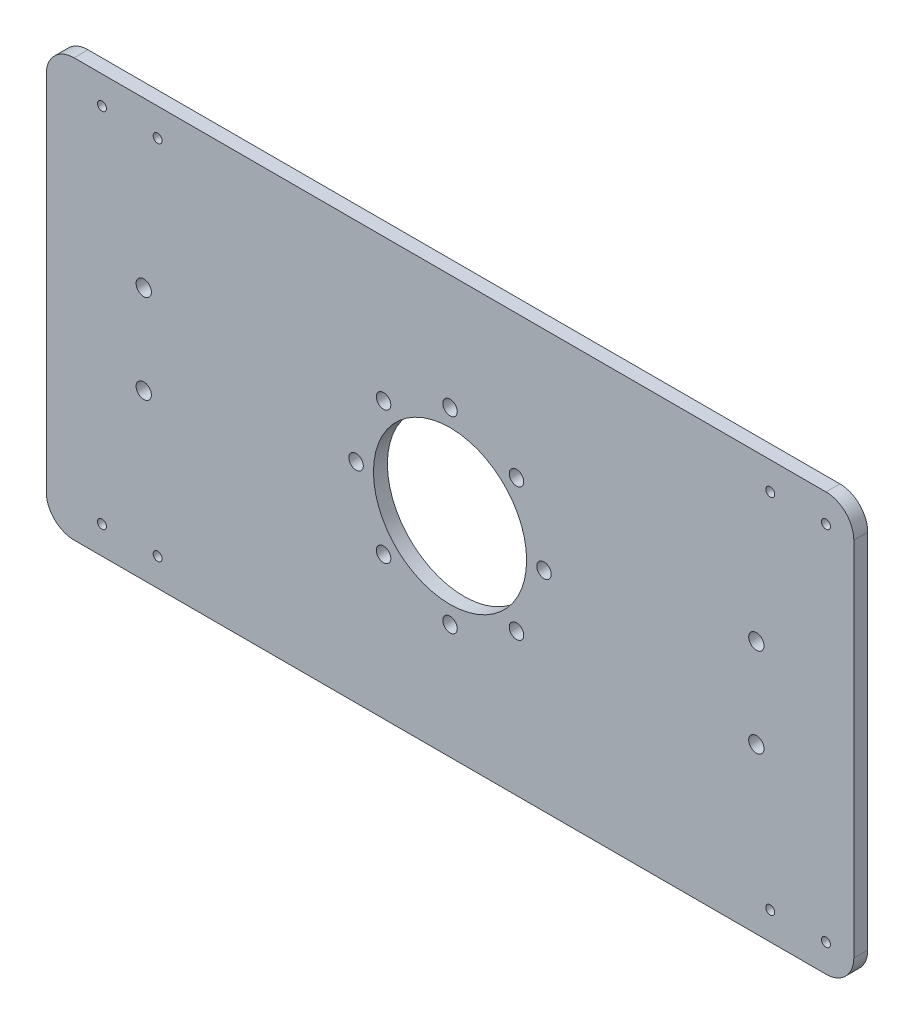
ISO-10303-21;
HEADER;
FILE_DESCRIPTION(('STEP AP214'),'2;1');
FILE_NAME('part.step','',(''),(''),'','','');
FILE_SCHEMA(('AUTOMOTIVE_DESIGN { 1 0 10303 214 1 1 1 1 }'));
ENDSEC;
DATA;
#1=APPLICATION_CONTEXT('core data for automotive mechanical design processes');
#2=APPLICATION_PROTOCOL_DEFINITION('international standard','automotive_design',2000,#1);
#3=PRODUCT_CONTEXT('',#1,'mechanical');
#4=PRODUCT('Part','Part','',(#3));
#5=PRODUCT_RELATED_PRODUCT_CATEGORY('part','',(#4));
#6=PRODUCT_DEFINITION_FORMATION('','',#4);
#7=PRODUCT_DEFINITION_CONTEXT('part definition',#1,'design');
#8=PRODUCT_DEFINITION('design','',#6,#7);
#9=PRODUCT_DEFINITION_SHAPE('','',#8);
#10=(LENGTH_UNIT() NAMED_UNIT(*) SI_UNIT(.MILLI.,.METRE.));
#11=(NAMED_UNIT(*) PLANE_ANGLE_UNIT() SI_UNIT($,.RADIAN.));
#12=(NAMED_UNIT(*) SI_UNIT($,.STERADIAN.) SOLID_ANGLE_UNIT());
#13=UNCERTAINTY_MEASURE_WITH_UNIT(LENGTH_MEASURE(1.E-05),#10,'distance_accuracy_value','');
#14=(GEOMETRIC_REPRESENTATION_CONTEXT(3) GLOBAL_UNCERTAINTY_ASSIGNED_CONTEXT((#13)) GLOBAL_UNIT_ASSIGNED_CONTEXT((#10,
#11,#12)) REPRESENTATION_CONTEXT('',''));
#15=CARTESIAN_POINT('',(0.,0.,0.));
#16=DIRECTION('',(0.,0.,1.));
#17=DIRECTION('',(1.,0.,0.));
#18=AXIS2_PLACEMENT_3D('',#15,#16,#17);
#19=CARTESIAN_POINT('',(145.,75.,5.));
#20=DIRECTION('',(-1.,0.,0.));
#21=DIRECTION('',(0.,0.,1.));
#22=AXIS2_PLACEMENT_3D('',#19,#20,#21);
#23=PLANE('',#22);
#24=DIRECTION('',(0.,1.,0.));
#25=VECTOR('',#24,1.);
#26=CARTESIAN_POINT('',(145.,75.,0.));
#27=LINE('',#26,#25);
#28=CARTESIAN_POINT('',(145.,-65.,0.));
#29=VERTEX_POINT('',#28);
#30=CARTESIAN_POINT('',(145.,65.,0.));
#31=VERTEX_POINT('',#30);
#32=EDGE_CURVE('E138',#29,#31,#27,.T.);
#33=ORIENTED_EDGE('',*,*,#32,.T.);
#34=DIRECTION('',(0.,0.,-1.));
#35=VECTOR('',#34,1.);
#36=CARTESIAN_POINT('',(145.,65.,5.));
#37=LINE('',#36,#35);
#38=CARTESIAN_POINT('',(145.,65.,5.));
#39=VERTEX_POINT('',#38);
#40=EDGE_CURVE('E116',#31,#39,#37,.F.);
#41=ORIENTED_EDGE('',*,*,#40,.T.);
#42=DIRECTION('',(0.,1.,0.));
#43=VECTOR('',#42,1.);
#44=CARTESIAN_POINT('',(145.,75.,5.));
#45=LINE('',#44,#43);
#46=CARTESIAN_POINT('',(145.,-65.,5.));
#47=VERTEX_POINT('',#46);
#48=EDGE_CURVE('E148',#47,#39,#45,.T.);
#49=ORIENTED_EDGE('',*,*,#48,.F.);
#50=DIRECTION('',(0.,0.,-1.));
#51=VECTOR('',#50,1.);
#52=CARTESIAN_POINT('',(145.,-65.,5.));
#53=LINE('',#52,#51);
#54=EDGE_CURVE('E121',#47,#29,#53,.T.);
#55=ORIENTED_EDGE('',*,*,#54,.T.);
#56=EDGE_LOOP('',(#33,#41,#49,#55));
#57=FACE_BOUND('',#56,.T.);
#58=ADVANCED_FACE('F45',(#57),#23,.F.);
#59=CARTESIAN_POINT('',(-145.,75.,5.));
#60=DIRECTION('',(0.,-1.,0.));
#61=DIRECTION('',(0.,0.,-1.));
#62=AXIS2_PLACEMENT_3D('',#59,#60,#61);
#63=PLANE('',#62);
#64=DIRECTION('',(-1.,0.,0.));
#65=VECTOR('',#64,1.);
#66=CARTESIAN_POINT('',(-145.,75.,5.));
#67=LINE('',#66,#65);
#68=CARTESIAN_POINT('',(135.,75.,5.));
#69=VERTEX_POINT('',#68);
#70=CARTESIAN_POINT('',(-135.,75.,5.));
#71=VERTEX_POINT('',#70);
#72=EDGE_CURVE('E131',#69,#71,#67,.T.);
#73=ORIENTED_EDGE('',*,*,#72,.F.);
#74=DIRECTION('',(0.,0.,-1.));
#75=VECTOR('',#74,1.);
#76=CARTESIAN_POINT('',(135.,75.,5.));
#77=LINE('',#76,#75);
#78=CARTESIAN_POINT('',(135.,75.,0.));
#79=VERTEX_POINT('',#78);
#80=EDGE_CURVE('E115',#69,#79,#77,.T.);
#81=ORIENTED_EDGE('',*,*,#80,.T.);
#82=DIRECTION('',(-1.,0.,0.));
#83=VECTOR('',#82,1.);
#84=CARTESIAN_POINT('',(-145.,75.,0.));
#85=LINE('',#84,#83);
#86=CARTESIAN_POINT('',(-135.,75.,0.));
#87=VERTEX_POINT('',#86);
#88=EDGE_CURVE('E128',#79,#87,#85,.T.);
#89=ORIENTED_EDGE('',*,*,#88,.T.);
#90=DIRECTION('',(0.,0.,-1.));
#91=VECTOR('',#90,1.);
#92=CARTESIAN_POINT('',(-135.,75.,5.));
#93=LINE('',#92,#91);
#94=EDGE_CURVE('E133',#87,#71,#93,.F.);
#95=ORIENTED_EDGE('',*,*,#94,.T.);
#96=EDGE_LOOP('',(#73,#81,#89,#95));
#97=FACE_BOUND('',#96,.T.);
#98=ADVANCED_FACE('F127',(#97),#63,.F.);
#99=CARTESIAN_POINT('',(-145.,75.,5.));
#100=DIRECTION('',(1.,0.,0.));
#101=DIRECTION('',(0.,1.,0.));
#102=AXIS2_PLACEMENT_3D('',#99,#100,#101);
#103=PLANE('',#102);
#104=DIRECTION('',(0.,-1.,0.));
#105=VECTOR('',#104,1.);
#106=CARTESIAN_POINT('',(-145.,75.,0.));
#107=LINE('',#106,#105);
#108=CARTESIAN_POINT('',(-145.,65.,0.));
#109=VERTEX_POINT('',#108);
#110=CARTESIAN_POINT('',(-145.,-65.,0.));
#111=VERTEX_POINT('',#110);
#112=EDGE_CURVE('E137',#109,#111,#107,.T.);
#113=ORIENTED_EDGE('',*,*,#112,.T.);
#114=DIRECTION('',(0.,0.,-1.));
#115=VECTOR('',#114,1.);
#116=CARTESIAN_POINT('',(-145.,-65.,5.));
#117=LINE('',#116,#115);
#118=CARTESIAN_POINT('',(-145.,-65.,5.));
#119=VERTEX_POINT('',#118);
#120=EDGE_CURVE('E11',#111,#119,#117,.F.);
#121=ORIENTED_EDGE('',*,*,#120,.T.);
#122=DIRECTION('',(0.,-1.,0.));
#123=VECTOR('',#122,1.);
#124=CARTESIAN_POINT('',(-145.,75.,5.));
#125=LINE('',#124,#123);
#126=CARTESIAN_POINT('',(-145.,65.,5.));
#127=VERTEX_POINT('',#126);
#128=EDGE_CURVE('E174',#127,#119,#125,.T.);
#129=ORIENTED_EDGE('',*,*,#128,.F.);
#130=DIRECTION('',(0.,0.,-1.));
#131=VECTOR('',#130,1.);
#132=CARTESIAN_POINT('',(-145.,65.,5.));
#133=LINE('',#132,#131);
#134=EDGE_CURVE('E53',#127,#109,#133,.T.);
#135=ORIENTED_EDGE('',*,*,#134,.T.);
#136=EDGE_LOOP('',(#113,#121,#129,#135));
#137=FACE_BOUND('',#136,.T.);
#138=ADVANCED_FACE('F172',(#137),#103,.F.);
#139=CARTESIAN_POINT('',(-145.,-75.,5.));
#140=DIRECTION('',(0.,1.,0.));
#141=DIRECTION('',(0.,0.,1.));
#142=AXIS2_PLACEMENT_3D('',#139,#140,#141);
#143=PLANE('',#142);
#144=DIRECTION('',(1.,0.,0.));
#145=VECTOR('',#144,1.);
#146=CARTESIAN_POINT('',(-145.,-75.,0.));
#147=LINE('',#146,#145);
#148=CARTESIAN_POINT('',(-135.,-75.,0.));
#149=VERTEX_POINT('',#148);
#150=CARTESIAN_POINT('',(135.,-75.,0.));
#151=VERTEX_POINT('',#150);
#152=EDGE_CURVE('E141',#149,#151,#147,.T.);
#153=ORIENTED_EDGE('',*,*,#152,.T.);
#154=DIRECTION('',(0.,0.,-1.));
#155=VECTOR('',#154,1.);
#156=CARTESIAN_POINT('',(135.,-75.,5.));
#157=LINE('',#156,#155);
#158=CARTESIAN_POINT('',(135.,-75.,5.));
#159=VERTEX_POINT('',#158);
#160=EDGE_CURVE('E60',#151,#159,#157,.F.);
#161=ORIENTED_EDGE('',*,*,#160,.T.);
#162=DIRECTION('',(1.,0.,0.));
#163=VECTOR('',#162,1.);
#164=CARTESIAN_POINT('',(-145.,-75.,5.));
#165=LINE('',#164,#163);
#166=CARTESIAN_POINT('',(-135.,-75.,5.));
#167=VERTEX_POINT('',#166);
#168=EDGE_CURVE('E149',#167,#159,#165,.T.);
#169=ORIENTED_EDGE('',*,*,#168,.F.);
#170=DIRECTION('',(0.,0.,-1.));
#171=VECTOR('',#170,1.);
#172=CARTESIAN_POINT('',(-135.,-75.,5.));
#173=LINE('',#172,#171);
#174=EDGE_CURVE('E165',#167,#149,#173,.T.);
#175=ORIENTED_EDGE('',*,*,#174,.T.);
#176=EDGE_LOOP('',(#153,#161,#169,#175));
#177=FACE_BOUND('',#176,.T.);
#178=ADVANCED_FACE('F181',(#177),#143,.F.);
#179=CARTESIAN_POINT('',(0.,0.,5.));
#180=DIRECTION('',(0.,0.,1.));
#181=DIRECTION('',(1.,0.,0.));
#182=AXIS2_PLACEMENT_3D('',#179,#180,#181);
#183=PLANE('',#182);
#184=CARTESIAN_POINT('',(-105.000000000003,-65.,5.));
#185=DIRECTION('',(0.,0.,1.));
#186=DIRECTION('',(1.,0.,0.));
#187=AXIS2_PLACEMENT_3D('',#184,#185,#186);
#188=CIRCLE('',#187,1.59999999999999);
#189=CARTESIAN_POINT('',(-103.400000000003,-65.,5.));
#190=VERTEX_POINT('',#189);
#191=EDGE_CURVE('E261',#190,#190,#188,.T.);
#192=ORIENTED_EDGE('',*,*,#191,.F.);
#193=EDGE_LOOP('',(#192));
#194=FACE_BOUND('',#193,.T.);
#195=CARTESIAN_POINT('',(-125.,65.,5.));
#196=DIRECTION('',(0.,0.,1.));
#197=DIRECTION('',(1.,0.,0.));
#198=AXIS2_PLACEMENT_3D('',#195,#196,#197);
#199=CIRCLE('',#198,1.60000000000002);
#200=CARTESIAN_POINT('',(-123.4,65.,5.));
#201=VERTEX_POINT('',#200);
#202=EDGE_CURVE('E268',#201,#201,#199,.T.);
#203=ORIENTED_EDGE('',*,*,#202,.F.);
#204=EDGE_LOOP('',(#203));
#205=FACE_BOUND('',#204,.T.);
#206=CARTESIAN_POINT('',(-105.,65.,5.));
#207=DIRECTION('',(0.,0.,1.));
#208=DIRECTION('',(1.,0.,0.));
#209=AXIS2_PLACEMENT_3D('',#206,#207,#208);
#210=CIRCLE('',#209,1.59999999999999);
#211=CARTESIAN_POINT('',(-103.4,65.,5.));
#212=VERTEX_POINT('',#211);
#213=EDGE_CURVE('E271',#212,#212,#210,.T.);
#214=ORIENTED_EDGE('',*,*,#213,.F.);
#215=EDGE_LOOP('',(#214));
#216=FACE_BOUND('',#215,.T.);
#217=CARTESIAN_POINT('',(115.,65.,5.));
#218=DIRECTION('',(0.,0.,1.));
#219=DIRECTION('',(1.,0.,0.));
#220=AXIS2_PLACEMENT_3D('',#217,#218,#219);
#221=CIRCLE('',#220,1.60000000000001);
#222=CARTESIAN_POINT('',(116.6,65.,5.));
#223=VERTEX_POINT('',#222);
#224=EDGE_CURVE('E274',#223,#223,#221,.T.);
#225=ORIENTED_EDGE('',*,*,#224,.F.);
#226=EDGE_LOOP('',(#225));
#227=FACE_BOUND('',#226,.T.);
#228=CARTESIAN_POINT('',(114.999999999997,-65.,5.));
#229=DIRECTION('',(0.,0.,1.));
#230=DIRECTION('',(1.,0.,0.));
#231=AXIS2_PLACEMENT_3D('',#228,#229,#230);
#232=CIRCLE('',#231,1.60000000000001);
#233=CARTESIAN_POINT('',(116.599999999997,-65.,5.));
#234=VERTEX_POINT('',#233);
#235=EDGE_CURVE('E277',#234,#234,#232,.T.);
#236=ORIENTED_EDGE('',*,*,#235,.F.);
#237=EDGE_LOOP('',(#236));
#238=FACE_BOUND('',#237,.T.);
#239=CARTESIAN_POINT('',(134.999999999997,-65.,5.));
#240=DIRECTION('',(0.,0.,1.));
#241=DIRECTION('',(1.,0.,0.));
#242=AXIS2_PLACEMENT_3D('',#239,#240,#241);
#243=CIRCLE('',#242,1.59999999999999);
#244=CARTESIAN_POINT('',(136.599999999997,-65.,5.));
#245=VERTEX_POINT('',#244);
#246=EDGE_CURVE('E280',#245,#245,#243,.T.);
#247=ORIENTED_EDGE('',*,*,#246,.F.);
#248=EDGE_LOOP('',(#247));
#249=FACE_BOUND('',#248,.T.);
#250=CARTESIAN_POINT('',(-125.000000000003,-65.,5.));
#251=DIRECTION('',(0.,0.,1.));
#252=DIRECTION('',(1.,0.,0.));
#253=AXIS2_PLACEMENT_3D('',#250,#251,#252);
#254=CIRCLE('',#253,1.60000000000005);
#255=CARTESIAN_POINT('',(-123.400000000003,-65.,5.));
#256=VERTEX_POINT('',#255);
#257=EDGE_CURVE('E283',#256,#256,#254,.T.);
#258=ORIENTED_EDGE('',*,*,#257,.F.);
#259=EDGE_LOOP('',(#258));
#260=FACE_BOUND('',#259,.T.);
#261=CARTESIAN_POINT('',(135.,65.,5.));
#262=DIRECTION('',(0.,0.,1.));
#263=DIRECTION('',(1.,0.,0.));
#264=AXIS2_PLACEMENT_3D('',#261,#262,#263);
#265=CIRCLE('',#264,1.59999999999999);
#266=CARTESIAN_POINT('',(136.6,65.,5.));
#267=VERTEX_POINT('',#266);
#268=EDGE_CURVE('E286',#267,#267,#265,.T.);
#269=ORIENTED_EDGE('',*,*,#268,.F.);
#270=EDGE_LOOP('',(#269));
#271=FACE_BOUND('',#270,.T.);
#272=CARTESIAN_POINT('',(-110.,16.,5.));
#273=DIRECTION('',(0.,0.,1.));
#274=DIRECTION('',(1.,0.,0.));
#275=AXIS2_PLACEMENT_3D('',#272,#273,#274);
#276=CIRCLE('',#275,2.75000000000001);
#277=CARTESIAN_POINT('',(-107.25,16.,5.));
#278=VERTEX_POINT('',#277);
#279=EDGE_CURVE('E222',#278,#278,#276,.T.);
#280=ORIENTED_EDGE('',*,*,#279,.F.);
#281=EDGE_LOOP('',(#280));
#282=FACE_BOUND('',#281,.T.);
#283=CARTESIAN_POINT('',(110.,15.9999999999863,5.));
#284=DIRECTION('',(0.,0.,1.));
#285=DIRECTION('',(1.,0.,0.));
#286=AXIS2_PLACEMENT_3D('',#283,#284,#285);
#287=CIRCLE('',#286,2.75000000000001);
#288=CARTESIAN_POINT('',(112.75,15.9999999999863,5.));
#289=VERTEX_POINT('',#288);
#290=EDGE_CURVE('E244',#289,#289,#287,.T.);
#291=ORIENTED_EDGE('',*,*,#290,.F.);
#292=EDGE_LOOP('',(#291));
#293=FACE_BOUND('',#292,.T.);
#294=CARTESIAN_POINT('',(110.,-16.0000000000137,5.));
#295=DIRECTION('',(0.,0.,1.));
#296=DIRECTION('',(1.,0.,0.));
#297=AXIS2_PLACEMENT_3D('',#294,#295,#296);
#298=CIRCLE('',#297,2.75000000000001);
#299=CARTESIAN_POINT('',(112.75,-16.0000000000137,5.));
#300=VERTEX_POINT('',#299);
#301=EDGE_CURVE('E247',#300,#300,#298,.T.);
#302=ORIENTED_EDGE('',*,*,#301,.F.);
#303=EDGE_LOOP('',(#302));
#304=FACE_BOUND('',#303,.T.);
#305=CARTESIAN_POINT('',(-110.,-16.,5.));
#306=DIRECTION('',(0.,0.,1.));
#307=DIRECTION('',(1.,0.,0.));
#308=AXIS2_PLACEMENT_3D('',#305,#306,#307);
#309=CIRCLE('',#308,2.75000000000001);
#310=CARTESIAN_POINT('',(-107.25,-16.,5.));
#311=VERTEX_POINT('',#310);
#312=EDGE_CURVE('E250',#311,#311,#309,.T.);
#313=ORIENTED_EDGE('',*,*,#312,.F.);
#314=EDGE_LOOP('',(#313));
#315=FACE_BOUND('',#314,.T.);
#316=CARTESIAN_POINT('',(-23.8648538648305,23.8648538650646,5.));
#317=DIRECTION('',(0.,0.,1.));
#318=DIRECTION('',(1.,0.,0.));
#319=AXIS2_PLACEMENT_3D('',#316,#317,#318);
#320=CIRCLE('',#319,2.6);
#321=CARTESIAN_POINT('',(-21.2648538648305,23.8648538650646,5.));
#322=VERTEX_POINT('',#321);
#323=EDGE_CURVE('E191',#322,#322,#320,.F.);
#324=ORIENTED_EDGE('',*,*,#323,.T.);
#325=EDGE_LOOP('',(#324));
#326=FACE_BOUND('',#325,.T.);
#327=CARTESIAN_POINT('',(2.15313822118257E-10,33.7500000000192,5.));
#328=DIRECTION('',(0.,0.,1.));
#329=DIRECTION('',(1.,0.,0.));
#330=AXIS2_PLACEMENT_3D('',#327,#328,#329);
#331=CIRCLE('',#330,2.6);
#332=CARTESIAN_POINT('',(2.60000000021531,33.7500000000192,5.));
#333=VERTEX_POINT('',#332);
#334=EDGE_CURVE('E210',#333,#333,#331,.F.);
#335=ORIENTED_EDGE('',*,*,#334,.T.);
#336=EDGE_LOOP('',(#335));
#337=FACE_BOUND('',#336,.T.);
#338=CARTESIAN_POINT('',(23.8648538652615,23.8648538650656,5.));
#339=DIRECTION('',(0.,0.,1.));
#340=DIRECTION('',(1.,0.,0.));
#341=AXIS2_PLACEMENT_3D('',#338,#339,#340);
#342=CIRCLE('',#341,2.6);
#343=CARTESIAN_POINT('',(26.4648538652616,23.8648538650656,5.));
#344=VERTEX_POINT('',#343);
#345=EDGE_CURVE('E204',#344,#344,#342,.F.);
#346=ORIENTED_EDGE('',*,*,#345,.T.);
#347=EDGE_LOOP('',(#346));
#348=FACE_BOUND('',#347,.T.);
#349=CARTESIAN_POINT('',(33.750000000216,1.98079471484518E-11,5.));
#350=DIRECTION('',(0.,0.,1.));
#351=DIRECTION('',(1.,0.,0.));
#352=AXIS2_PLACEMENT_3D('',#349,#350,#351);
#353=CIRCLE('',#352,2.6);
#354=CARTESIAN_POINT('',(36.350000000216,1.98079471484518E-11,5.));
#355=VERTEX_POINT('',#354);
#356=EDGE_CURVE('E197',#355,#355,#353,.F.);
#357=ORIENTED_EDGE('',*,*,#356,.T.);
#358=EDGE_LOOP('',(#357));
#359=FACE_BOUND('',#358,.T.);
#360=CARTESIAN_POINT('',(23.8648538652624,-23.8648538650264,5.));
#361=DIRECTION('',(0.,0.,1.));
#362=DIRECTION('',(1.,0.,0.));
#363=AXIS2_PLACEMENT_3D('',#360,#361,#362);
#364=CIRCLE('',#363,2.6);
#365=CARTESIAN_POINT('',(26.4648538652624,-23.8648538650264,5.));
#366=VERTEX_POINT('',#365);
#367=EDGE_CURVE('E198',#366,#366,#364,.F.);
#368=ORIENTED_EDGE('',*,*,#367,.T.);
#369=EDGE_LOOP('',(#368));
#370=FACE_BOUND('',#369,.T.);
#371=CARTESIAN_POINT('',(2.16538112226446E-10,-33.7499999999808,5.));
#372=DIRECTION('',(0.,0.,1.));
#373=DIRECTION('',(1.,0.,0.));
#374=AXIS2_PLACEMENT_3D('',#371,#372,#373);
#375=CIRCLE('',#374,2.6);
#376=CARTESIAN_POINT('',(2.60000000021654,-33.7499999999808,5.));
#377=VERTEX_POINT('',#376);
#378=EDGE_CURVE('E234',#377,#377,#375,.F.);
#379=ORIENTED_EDGE('',*,*,#378,.T.);
#380=EDGE_LOOP('',(#379));
#381=FACE_BOUND('',#380,.T.);
#382=CARTESIAN_POINT('',(-23.8648538648296,-23.8648538650271,5.));
#383=DIRECTION('',(0.,0.,1.));
#384=DIRECTION('',(1.,0.,0.));
#385=AXIS2_PLACEMENT_3D('',#382,#383,#384);
#386=CIRCLE('',#385,2.6);
#387=CARTESIAN_POINT('',(-21.2648538648296,-23.8648538650271,5.));
#388=VERTEX_POINT('',#387);
#389=EDGE_CURVE('E228',#388,#388,#386,.F.);
#390=ORIENTED_EDGE('',*,*,#389,.T.);
#391=EDGE_LOOP('',(#390));
#392=FACE_BOUND('',#391,.T.);
#393=CARTESIAN_POINT('',(-33.749999999784,1.88244580816738E-11,5.));
#394=DIRECTION('',(0.,0.,1.));
#395=DIRECTION('',(1.,0.,0.));
#396=AXIS2_PLACEMENT_3D('',#393,#394,#395);
#397=CIRCLE('',#396,2.6);
#398=CARTESIAN_POINT('',(-31.149999999784,1.88244580816738E-11,5.));
#399=VERTEX_POINT('',#398);
#400=EDGE_CURVE('E221',#399,#399,#397,.F.);
#401=ORIENTED_EDGE('',*,*,#400,.T.);
#402=EDGE_LOOP('',(#401));
#403=FACE_BOUND('',#402,.T.);
#404=CARTESIAN_POINT('',(2.15990261061066E-10,2.06374475796517E-11,5.));
#405=DIRECTION('',(0.,0.,1.));
#406=DIRECTION('',(1.,0.,0.));
#407=AXIS2_PLACEMENT_3D('',#404,#405,#406);
#408=CIRCLE('',#407,27.5);
#409=CARTESIAN_POINT('',(27.500000000216,2.06374475796517E-11,5.));
#410=VERTEX_POINT('',#409);
#411=EDGE_CURVE('E188',#410,#410,#408,.F.);
#412=ORIENTED_EDGE('',*,*,#411,.T.);
#413=EDGE_LOOP('',(#412));
#414=FACE_BOUND('',#413,.T.);
#415=ORIENTED_EDGE('',*,*,#48,.T.);
#416=CARTESIAN_POINT('',(135.,65.,5.));
#417=DIRECTION('',(0.,0.,1.));
#418=DIRECTION('',(1.,0.,0.));
#419=AXIS2_PLACEMENT_3D('',#416,#417,#418);
#420=CIRCLE('',#419,10.);
#421=EDGE_CURVE('E163',#39,#69,#420,.T.);
#422=ORIENTED_EDGE('',*,*,#421,.T.);
#423=ORIENTED_EDGE('',*,*,#72,.T.);
#424=CARTESIAN_POINT('',(-135.,65.,5.));
#425=DIRECTION('',(0.,0.,1.));
#426=DIRECTION('',(1.,0.,0.));
#427=AXIS2_PLACEMENT_3D('',#424,#425,#426);
#428=CIRCLE('',#427,10.);
#429=EDGE_CURVE('E158',#71,#127,#428,.T.);
#430=ORIENTED_EDGE('',*,*,#429,.T.);
#431=ORIENTED_EDGE('',*,*,#128,.T.);
#432=CARTESIAN_POINT('',(-135.,-65.,5.));
#433=DIRECTION('',(0.,0.,1.));
#434=DIRECTION('',(1.,0.,0.));
#435=AXIS2_PLACEMENT_3D('',#432,#433,#434);
#436=CIRCLE('',#435,10.);
#437=EDGE_CURVE('E67',#119,#167,#436,.T.);
#438=ORIENTED_EDGE('',*,*,#437,.T.);
#439=ORIENTED_EDGE('',*,*,#168,.T.);
#440=CARTESIAN_POINT('',(135.,-65.,5.));
#441=DIRECTION('',(0.,0.,1.));
#442=DIRECTION('',(1.,0.,0.));
#443=AXIS2_PLACEMENT_3D('',#440,#441,#442);
#444=CIRCLE('',#443,10.);
#445=EDGE_CURVE('E161',#159,#47,#444,.T.);
#446=ORIENTED_EDGE('',*,*,#445,.T.);
#447=EDGE_LOOP('',(#415,#422,#423,#430,#431,#438,#439,#446));
#448=FACE_BOUND('',#447,.T.);
#449=ADVANCED_FACE('F319',(#194,#205,#216,#227,#238,#249,#260,#271,#282,#293,#304,#315,#326,
#337,#348,#359,#370,#381,#392,#403,#414,#448),#183,.T.);
#450=CARTESIAN_POINT('',(0.,0.,0.));
#451=DIRECTION('',(0.,0.,1.));
#452=DIRECTION('',(1.,0.,0.));
#453=AXIS2_PLACEMENT_3D('',#450,#451,#452);
#454=PLANE('',#453);
#455=CARTESIAN_POINT('',(-105.000000000003,-65.,0.));
#456=DIRECTION('',(0.,0.,-1.));
#457=DIRECTION('',(-1.,0.,0.));
#458=AXIS2_PLACEMENT_3D('',#455,#456,#457);
#459=CIRCLE('',#458,1.59999999999999);
#460=CARTESIAN_POINT('',(-106.600000000003,-65.,0.));
#461=VERTEX_POINT('',#460);
#462=EDGE_CURVE('E299',#461,#461,#459,.T.);
#463=ORIENTED_EDGE('',*,*,#462,.F.);
#464=EDGE_LOOP('',(#463));
#465=FACE_BOUND('',#464,.T.);
#466=CARTESIAN_POINT('',(-125.,65.,0.));
#467=DIRECTION('',(0.,0.,-1.));
#468=DIRECTION('',(-1.,0.,0.));
#469=AXIS2_PLACEMENT_3D('',#466,#467,#468);
#470=CIRCLE('',#469,1.60000000000002);
#471=CARTESIAN_POINT('',(-126.6,65.,0.));
#472=VERTEX_POINT('',#471);
#473=EDGE_CURVE('E296',#472,#472,#470,.T.);
#474=ORIENTED_EDGE('',*,*,#473,.F.);
#475=EDGE_LOOP('',(#474));
#476=FACE_BOUND('',#475,.T.);
#477=CARTESIAN_POINT('',(-105.,65.,0.));
#478=DIRECTION('',(0.,0.,-1.));
#479=DIRECTION('',(-1.,0.,0.));
#480=AXIS2_PLACEMENT_3D('',#477,#478,#479);
#481=CIRCLE('',#480,1.59999999999999);
#482=CARTESIAN_POINT('',(-106.6,65.,0.));
#483=VERTEX_POINT('',#482);
#484=EDGE_CURVE('E293',#483,#483,#481,.T.);
#485=ORIENTED_EDGE('',*,*,#484,.F.);
#486=EDGE_LOOP('',(#485));
#487=FACE_BOUND('',#486,.T.);
#488=CARTESIAN_POINT('',(115.,65.,0.));
#489=DIRECTION('',(0.,0.,-1.));
#490=DIRECTION('',(-1.,0.,0.));
#491=AXIS2_PLACEMENT_3D('',#488,#489,#490);
#492=CIRCLE('',#491,1.60000000000001);
#493=CARTESIAN_POINT('',(113.4,65.,0.));
#494=VERTEX_POINT('',#493);
#495=EDGE_CURVE('E292',#494,#494,#492,.T.);
#496=ORIENTED_EDGE('',*,*,#495,.F.);
#497=EDGE_LOOP('',(#496));
#498=FACE_BOUND('',#497,.T.);
#499=CARTESIAN_POINT('',(114.999999999997,-65.,0.));
#500=DIRECTION('',(0.,0.,-1.));
#501=DIRECTION('',(-1.,0.,0.));
#502=AXIS2_PLACEMENT_3D('',#499,#500,#501);
#503=CIRCLE('',#502,1.60000000000001);
#504=CARTESIAN_POINT('',(113.399999999997,-65.,0.));
#505=VERTEX_POINT('',#504);
#506=EDGE_CURVE('E308',#505,#505,#503,.T.);
#507=ORIENTED_EDGE('',*,*,#506,.F.);
#508=EDGE_LOOP('',(#507));
#509=FACE_BOUND('',#508,.T.);
#510=CARTESIAN_POINT('',(134.999999999997,-65.,0.));
#511=DIRECTION('',(0.,0.,-1.));
#512=DIRECTION('',(-1.,0.,0.));
#513=AXIS2_PLACEMENT_3D('',#510,#511,#512);
#514=CIRCLE('',#513,1.59999999999999);
#515=CARTESIAN_POINT('',(133.399999999997,-65.,0.));
#516=VERTEX_POINT('',#515);
#517=EDGE_CURVE('E305',#516,#516,#514,.T.);
#518=ORIENTED_EDGE('',*,*,#517,.F.);
#519=EDGE_LOOP('',(#518));
#520=FACE_BOUND('',#519,.T.);
#521=CARTESIAN_POINT('',(-125.000000000003,-65.,0.));
#522=DIRECTION('',(0.,0.,-1.));
#523=DIRECTION('',(-1.,0.,0.));
#524=AXIS2_PLACEMENT_3D('',#521,#522,#523);
#525=CIRCLE('',#524,1.60000000000005);
#526=CARTESIAN_POINT('',(-126.600000000003,-65.,0.));
#527=VERTEX_POINT('',#526);
#528=EDGE_CURVE('E302',#527,#527,#525,.T.);
#529=ORIENTED_EDGE('',*,*,#528,.F.);
#530=EDGE_LOOP('',(#529));
#531=FACE_BOUND('',#530,.T.);
#532=CARTESIAN_POINT('',(135.,65.,0.));
#533=DIRECTION('',(0.,0.,-1.));
#534=DIRECTION('',(-1.,0.,0.));
#535=AXIS2_PLACEMENT_3D('',#532,#533,#534);
#536=CIRCLE('',#535,1.59999999999999);
#537=CARTESIAN_POINT('',(133.4,65.,0.));
#538=VERTEX_POINT('',#537);
#539=EDGE_CURVE('E289',#538,#538,#536,.T.);
#540=ORIENTED_EDGE('',*,*,#539,.F.);
#541=EDGE_LOOP('',(#540));
#542=FACE_BOUND('',#541,.T.);
#543=CARTESIAN_POINT('',(-110.,16.,0.));
#544=DIRECTION('',(0.,0.,-1.));
#545=DIRECTION('',(-1.,0.,0.));
#546=AXIS2_PLACEMENT_3D('',#543,#544,#545);
#547=CIRCLE('',#546,2.75000000000001);
#548=CARTESIAN_POINT('',(-112.75,16.,0.));
#549=VERTEX_POINT('',#548);
#550=EDGE_CURVE('E257',#549,#549,#547,.T.);
#551=ORIENTED_EDGE('',*,*,#550,.F.);
#552=EDGE_LOOP('',(#551));
#553=FACE_BOUND('',#552,.T.);
#554=CARTESIAN_POINT('',(110.,15.9999999999863,0.));
#555=DIRECTION('',(0.,0.,-1.));
#556=DIRECTION('',(-1.,0.,0.));
#557=AXIS2_PLACEMENT_3D('',#554,#555,#556);
#558=CIRCLE('',#557,2.75000000000001);
#559=CARTESIAN_POINT('',(107.25,15.9999999999863,0.));
#560=VERTEX_POINT('',#559);
#561=EDGE_CURVE('E260',#560,#560,#558,.T.);
#562=ORIENTED_EDGE('',*,*,#561,.F.);
#563=EDGE_LOOP('',(#562));
#564=FACE_BOUND('',#563,.T.);
#565=CARTESIAN_POINT('',(110.,-16.0000000000137,0.));
#566=DIRECTION('',(0.,0.,-1.));
#567=DIRECTION('',(-1.,0.,0.));
#568=AXIS2_PLACEMENT_3D('',#565,#566,#567);
#569=CIRCLE('',#568,2.75000000000001);
#570=CARTESIAN_POINT('',(107.25,-16.0000000000137,0.));
#571=VERTEX_POINT('',#570);
#572=EDGE_CURVE('E256',#571,#571,#569,.T.);
#573=ORIENTED_EDGE('',*,*,#572,.F.);
#574=EDGE_LOOP('',(#573));
#575=FACE_BOUND('',#574,.T.);
#576=CARTESIAN_POINT('',(-110.,-16.,0.));
#577=DIRECTION('',(0.,0.,-1.));
#578=DIRECTION('',(-1.,0.,0.));
#579=AXIS2_PLACEMENT_3D('',#576,#577,#578);
#580=CIRCLE('',#579,2.75000000000001);
#581=CARTESIAN_POINT('',(-112.75,-16.,0.));
#582=VERTEX_POINT('',#581);
#583=EDGE_CURVE('E253',#582,#582,#580,.T.);
#584=ORIENTED_EDGE('',*,*,#583,.F.);
#585=EDGE_LOOP('',(#584));
#586=FACE_BOUND('',#585,.T.);
#587=CARTESIAN_POINT('',(-23.8648538648305,23.8648538650646,0.));
#588=DIRECTION('',(0.,0.,-1.));
#589=DIRECTION('',(-1.,0.,0.));
#590=AXIS2_PLACEMENT_3D('',#587,#588,#589);
#591=CIRCLE('',#590,2.6);
#592=CARTESIAN_POINT('',(-26.4648538648305,23.8648538650646,0.));
#593=VERTEX_POINT('',#592);
#594=EDGE_CURVE('E213',#593,#593,#591,.T.);
#595=ORIENTED_EDGE('',*,*,#594,.F.);
#596=EDGE_LOOP('',(#595));
#597=FACE_BOUND('',#596,.T.);
#598=CARTESIAN_POINT('',(2.15313822118257E-10,33.7500000000192,0.));
#599=DIRECTION('',(0.,0.,-1.));
#600=DIRECTION('',(-1.,0.,0.));
#601=AXIS2_PLACEMENT_3D('',#598,#599,#600);
#602=CIRCLE('',#601,2.6);
#603=CARTESIAN_POINT('',(-2.59999999978468,33.7500000000192,0.));
#604=VERTEX_POINT('',#603);
#605=EDGE_CURVE('E207',#604,#604,#602,.T.);
#606=ORIENTED_EDGE('',*,*,#605,.F.);
#607=EDGE_LOOP('',(#606));
#608=FACE_BOUND('',#607,.T.);
#609=CARTESIAN_POINT('',(23.8648538652615,23.8648538650656,0.));
#610=DIRECTION('',(0.,0.,-1.));
#611=DIRECTION('',(-1.,0.,0.));
#612=AXIS2_PLACEMENT_3D('',#609,#610,#611);
#613=CIRCLE('',#612,2.6);
#614=CARTESIAN_POINT('',(21.2648538652615,23.8648538650656,0.));
#615=VERTEX_POINT('',#614);
#616=EDGE_CURVE('E201',#615,#615,#613,.T.);
#617=ORIENTED_EDGE('',*,*,#616,.F.);
#618=EDGE_LOOP('',(#617));
#619=FACE_BOUND('',#618,.T.);
#620=CARTESIAN_POINT('',(33.750000000216,1.98079471484518E-11,0.));
#621=DIRECTION('',(0.,0.,-1.));
#622=DIRECTION('',(-1.,0.,0.));
#623=AXIS2_PLACEMENT_3D('',#620,#621,#622);
#624=CIRCLE('',#623,2.6);
#625=CARTESIAN_POINT('',(31.150000000216,1.98079471484518E-11,0.));
#626=VERTEX_POINT('',#625);
#627=EDGE_CURVE('E194',#626,#626,#624,.T.);
#628=ORIENTED_EDGE('',*,*,#627,.F.);
#629=EDGE_LOOP('',(#628));
#630=FACE_BOUND('',#629,.T.);
#631=CARTESIAN_POINT('',(23.8648538652624,-23.8648538650264,0.));
#632=DIRECTION('',(0.,0.,-1.));
#633=DIRECTION('',(-1.,0.,0.));
#634=AXIS2_PLACEMENT_3D('',#631,#632,#633);
#635=CIRCLE('',#634,2.6);
#636=CARTESIAN_POINT('',(21.2648538652624,-23.8648538650264,0.));
#637=VERTEX_POINT('',#636);
#638=EDGE_CURVE('E237',#637,#637,#635,.T.);
#639=ORIENTED_EDGE('',*,*,#638,.F.);
#640=EDGE_LOOP('',(#639));
#641=FACE_BOUND('',#640,.T.);
#642=CARTESIAN_POINT('',(2.16538112226446E-10,-33.7499999999808,0.));
#643=DIRECTION('',(0.,0.,-1.));
#644=DIRECTION('',(-1.,0.,0.));
#645=AXIS2_PLACEMENT_3D('',#642,#643,#644);
#646=CIRCLE('',#645,2.6);
#647=CARTESIAN_POINT('',(-2.59999999978346,-33.7499999999808,0.));
#648=VERTEX_POINT('',#647);
#649=EDGE_CURVE('E231',#648,#648,#646,.T.);
#650=ORIENTED_EDGE('',*,*,#649,.F.);
#651=EDGE_LOOP('',(#650));
#652=FACE_BOUND('',#651,.T.);
#653=CARTESIAN_POINT('',(-23.8648538648296,-23.8648538650271,0.));
#654=DIRECTION('',(0.,0.,-1.));
#655=DIRECTION('',(-1.,0.,0.));
#656=AXIS2_PLACEMENT_3D('',#653,#654,#655);
#657=CIRCLE('',#656,2.6);
#658=CARTESIAN_POINT('',(-26.4648538648296,-23.8648538650271,0.));
#659=VERTEX_POINT('',#658);
#660=EDGE_CURVE('E225',#659,#659,#657,.T.);
#661=ORIENTED_EDGE('',*,*,#660,.F.);
#662=EDGE_LOOP('',(#661));
#663=FACE_BOUND('',#662,.T.);
#664=CARTESIAN_POINT('',(-33.749999999784,1.88244580816738E-11,0.));
#665=DIRECTION('',(0.,0.,-1.));
#666=DIRECTION('',(-1.,0.,0.));
#667=AXIS2_PLACEMENT_3D('',#664,#665,#666);
#668=CIRCLE('',#667,2.6);
#669=CARTESIAN_POINT('',(-36.349999999784,1.88244580816738E-11,0.));
#670=VERTEX_POINT('',#669);
#671=EDGE_CURVE('E218',#670,#670,#668,.T.);
#672=ORIENTED_EDGE('',*,*,#671,.F.);
#673=EDGE_LOOP('',(#672));
#674=FACE_BOUND('',#673,.T.);
#675=CARTESIAN_POINT('',(2.15990261061066E-10,2.06374475796517E-11,0.));
#676=DIRECTION('',(0.,0.,-1.));
#677=DIRECTION('',(-1.,0.,0.));
#678=AXIS2_PLACEMENT_3D('',#675,#676,#677);
#679=CIRCLE('',#678,27.5);
#680=CARTESIAN_POINT('',(-27.499999999784,2.06374475796517E-11,0.));
#681=VERTEX_POINT('',#680);
#682=EDGE_CURVE('E143',#681,#681,#679,.T.);
#683=ORIENTED_EDGE('',*,*,#682,.F.);
#684=EDGE_LOOP('',(#683));
#685=FACE_BOUND('',#684,.T.);
#686=ORIENTED_EDGE('',*,*,#88,.F.);
#687=CARTESIAN_POINT('',(135.,65.,0.));
#688=DIRECTION('',(0.,0.,1.));
#689=DIRECTION('',(1.,0.,0.));
#690=AXIS2_PLACEMENT_3D('',#687,#688,#689);
#691=CIRCLE('',#690,10.);
#692=EDGE_CURVE('E111',#79,#31,#691,.F.);
#693=ORIENTED_EDGE('',*,*,#692,.T.);
#694=ORIENTED_EDGE('',*,*,#32,.F.);
#695=CARTESIAN_POINT('',(135.,-65.,0.));
#696=DIRECTION('',(0.,0.,1.));
#697=DIRECTION('',(1.,0.,0.));
#698=AXIS2_PLACEMENT_3D('',#695,#696,#697);
#699=CIRCLE('',#698,10.);
#700=EDGE_CURVE('E122',#29,#151,#699,.F.);
#701=ORIENTED_EDGE('',*,*,#700,.T.);
#702=ORIENTED_EDGE('',*,*,#152,.F.);
#703=CARTESIAN_POINT('',(-135.,-65.,0.));
#704=DIRECTION('',(0.,0.,1.));
#705=DIRECTION('',(1.,0.,0.));
#706=AXIS2_PLACEMENT_3D('',#703,#704,#705);
#707=CIRCLE('',#706,10.);
#708=EDGE_CURVE('E152',#149,#111,#707,.F.);
#709=ORIENTED_EDGE('',*,*,#708,.T.);
#710=ORIENTED_EDGE('',*,*,#112,.F.);
#711=CARTESIAN_POINT('',(-135.,65.,0.));
#712=DIRECTION('',(0.,0.,1.));
#713=DIRECTION('',(1.,0.,0.));
#714=AXIS2_PLACEMENT_3D('',#711,#712,#713);
#715=CIRCLE('',#714,10.);
#716=EDGE_CURVE('E132',#109,#87,#715,.F.);
#717=ORIENTED_EDGE('',*,*,#716,.T.);
#718=EDGE_LOOP('',(#686,#693,#694,#701,#702,#709,#710,#717));
#719=FACE_BOUND('',#718,.T.);
#720=ADVANCED_FACE('F135',(#465,#476,#487,#498,#509,#520,#531,#542,#553,#564,#575,#586,#597,
#608,#619,#630,#641,#652,#663,#674,#685,#719),#454,.F.);
#721=CARTESIAN_POINT('',(2.15990261061066E-10,2.06374475796517E-11,5.001));
#722=DIRECTION('',(0.,0.,-1.));
#723=DIRECTION('',(-1.,0.,0.));
#724=AXIS2_PLACEMENT_3D('',#721,#722,#723);
#725=CYLINDRICAL_SURFACE('',#724,27.5);
#726=ORIENTED_EDGE('',*,*,#411,.F.);
#727=EDGE_LOOP('',(#726));
#728=FACE_BOUND('',#727,.T.);
#729=ORIENTED_EDGE('',*,*,#682,.T.);
#730=EDGE_LOOP('',(#729));
#731=FACE_BOUND('',#730,.T.);
#732=ADVANCED_FACE('F318',(#728,#731),#725,.F.);
#733=CARTESIAN_POINT('',(-33.749999999784,1.88244580816738E-11,5.001));
#734=DIRECTION('',(0.,0.,-1.));
#735=DIRECTION('',(-1.,0.,0.));
#736=AXIS2_PLACEMENT_3D('',#733,#734,#735);
#737=CYLINDRICAL_SURFACE('',#736,2.6);
#738=ORIENTED_EDGE('',*,*,#400,.F.);
#739=EDGE_LOOP('',(#738));
#740=FACE_BOUND('',#739,.T.);
#741=ORIENTED_EDGE('',*,*,#671,.T.);
#742=EDGE_LOOP('',(#741));
#743=FACE_BOUND('',#742,.T.);
#744=ADVANCED_FACE('F355',(#740,#743),#737,.F.);
#745=CARTESIAN_POINT('',(-23.8648538648296,-23.8648538650271,5.001));
#746=DIRECTION('',(0.,0.,-1.));
#747=DIRECTION('',(-1.,0.,0.));
#748=AXIS2_PLACEMENT_3D('',#745,#746,#747);
#749=CYLINDRICAL_SURFACE('',#748,2.6);
#750=ORIENTED_EDGE('',*,*,#389,.F.);
#751=EDGE_LOOP('',(#750));
#752=FACE_BOUND('',#751,.T.);
#753=ORIENTED_EDGE('',*,*,#660,.T.);
#754=EDGE_LOOP('',(#753));
#755=FACE_BOUND('',#754,.T.);
#756=ADVANCED_FACE('F361',(#752,#755),#749,.F.);
#757=CARTESIAN_POINT('',(2.16538112226446E-10,-33.7499999999808,5.001));
#758=DIRECTION('',(0.,0.,-1.));
#759=DIRECTION('',(-1.,0.,0.));
#760=AXIS2_PLACEMENT_3D('',#757,#758,#759);
#761=CYLINDRICAL_SURFACE('',#760,2.6);
#762=ORIENTED_EDGE('',*,*,#378,.F.);
#763=EDGE_LOOP('',(#762));
#764=FACE_BOUND('',#763,.T.);
#765=ORIENTED_EDGE('',*,*,#649,.T.);
#766=EDGE_LOOP('',(#765));
#767=FACE_BOUND('',#766,.T.);
#768=ADVANCED_FACE('F557',(#764,#767),#761,.F.);
#769=CARTESIAN_POINT('',(23.8648538652624,-23.8648538650264,5.001));
#770=DIRECTION('',(0.,0.,-1.));
#771=DIRECTION('',(-1.,0.,0.));
#772=AXIS2_PLACEMENT_3D('',#769,#770,#771);
#773=CYLINDRICAL_SURFACE('',#772,2.6);
#774=ORIENTED_EDGE('',*,*,#367,.F.);
#775=EDGE_LOOP('',(#774));
#776=FACE_BOUND('',#775,.T.);
#777=ORIENTED_EDGE('',*,*,#638,.T.);
#778=EDGE_LOOP('',(#777));
#779=FACE_BOUND('',#778,.T.);
#780=ADVANCED_FACE('F553',(#776,#779),#773,.F.);
#781=CARTESIAN_POINT('',(33.750000000216,1.98079471484518E-11,5.001));
#782=DIRECTION('',(0.,0.,-1.));
#783=DIRECTION('',(-1.,0.,0.));
#784=AXIS2_PLACEMENT_3D('',#781,#782,#783);
#785=CYLINDRICAL_SURFACE('',#784,2.6);
#786=ORIENTED_EDGE('',*,*,#356,.F.);
#787=EDGE_LOOP('',(#786));
#788=FACE_BOUND('',#787,.T.);
#789=ORIENTED_EDGE('',*,*,#627,.T.);
#790=EDGE_LOOP('',(#789));
#791=FACE_BOUND('',#790,.T.);
#792=ADVANCED_FACE('F556',(#788,#791),#785,.F.);
#793=CARTESIAN_POINT('',(23.8648538652615,23.8648538650656,5.001));
#794=DIRECTION('',(0.,0.,-1.));
#795=DIRECTION('',(-1.,0.,0.));
#796=AXIS2_PLACEMENT_3D('',#793,#794,#795);
#797=CYLINDRICAL_SURFACE('',#796,2.6);
#798=ORIENTED_EDGE('',*,*,#345,.F.);
#799=EDGE_LOOP('',(#798));
#800=FACE_BOUND('',#799,.T.);
#801=ORIENTED_EDGE('',*,*,#616,.T.);
#802=EDGE_LOOP('',(#801));
#803=FACE_BOUND('',#802,.T.);
#804=ADVANCED_FACE('F570',(#800,#803),#797,.F.);
#805=CARTESIAN_POINT('',(2.15313822118257E-10,33.7500000000192,5.001));
#806=DIRECTION('',(0.,0.,-1.));
#807=DIRECTION('',(-1.,0.,0.));
#808=AXIS2_PLACEMENT_3D('',#805,#806,#807);
#809=CYLINDRICAL_SURFACE('',#808,2.6);
#810=ORIENTED_EDGE('',*,*,#334,.F.);
#811=EDGE_LOOP('',(#810));
#812=FACE_BOUND('',#811,.T.);
#813=ORIENTED_EDGE('',*,*,#605,.T.);
#814=EDGE_LOOP('',(#813));
#815=FACE_BOUND('',#814,.T.);
#816=ADVANCED_FACE('F566',(#812,#815),#809,.F.);
#817=CARTESIAN_POINT('',(-23.8648538648305,23.8648538650646,5.001));
#818=DIRECTION('',(0.,0.,-1.));
#819=DIRECTION('',(-1.,0.,0.));
#820=AXIS2_PLACEMENT_3D('',#817,#818,#819);
#821=CYLINDRICAL_SURFACE('',#820,2.6);
#822=ORIENTED_EDGE('',*,*,#323,.F.);
#823=EDGE_LOOP('',(#822));
#824=FACE_BOUND('',#823,.T.);
#825=ORIENTED_EDGE('',*,*,#594,.T.);
#826=EDGE_LOOP('',(#825));
#827=FACE_BOUND('',#826,.T.);
#828=ADVANCED_FACE('F380',(#824,#827),#821,.F.);
#829=CARTESIAN_POINT('',(135.,65.,5.));
#830=DIRECTION('',(0.,0.,-1.));
#831=DIRECTION('',(-1.,0.,0.));
#832=AXIS2_PLACEMENT_3D('',#829,#830,#831);
#833=CYLINDRICAL_SURFACE('',#832,10.);
#834=ORIENTED_EDGE('',*,*,#421,.F.);
#835=ORIENTED_EDGE('',*,*,#40,.F.);
#836=ORIENTED_EDGE('',*,*,#692,.F.);
#837=ORIENTED_EDGE('',*,*,#80,.F.);
#838=EDGE_LOOP('',(#834,#835,#836,#837));
#839=FACE_BOUND('',#838,.T.);
#840=ADVANCED_FACE('F114',(#839),#833,.T.);
#841=CARTESIAN_POINT('',(135.,-65.,5.));
#842=DIRECTION('',(0.,0.,-1.));
#843=DIRECTION('',(-1.,0.,0.));
#844=AXIS2_PLACEMENT_3D('',#841,#842,#843);
#845=CYLINDRICAL_SURFACE('',#844,10.);
#846=ORIENTED_EDGE('',*,*,#445,.F.);
#847=ORIENTED_EDGE('',*,*,#160,.F.);
#848=ORIENTED_EDGE('',*,*,#700,.F.);
#849=ORIENTED_EDGE('',*,*,#54,.F.);
#850=EDGE_LOOP('',(#846,#847,#848,#849));
#851=FACE_BOUND('',#850,.T.);
#852=ADVANCED_FACE('F379',(#851),#845,.T.);
#853=CARTESIAN_POINT('',(-135.,-65.,5.));
#854=DIRECTION('',(0.,0.,-1.));
#855=DIRECTION('',(-1.,0.,0.));
#856=AXIS2_PLACEMENT_3D('',#853,#854,#855);
#857=CYLINDRICAL_SURFACE('',#856,10.);
#858=ORIENTED_EDGE('',*,*,#437,.F.);
#859=ORIENTED_EDGE('',*,*,#120,.F.);
#860=ORIENTED_EDGE('',*,*,#708,.F.);
#861=ORIENTED_EDGE('',*,*,#174,.F.);
#862=EDGE_LOOP('',(#858,#859,#860,#861));
#863=FACE_BOUND('',#862,.T.);
#864=ADVANCED_FACE('F180',(#863),#857,.T.);
#865=CARTESIAN_POINT('',(-135.,65.,5.));
#866=DIRECTION('',(0.,0.,-1.));
#867=DIRECTION('',(-1.,0.,0.));
#868=AXIS2_PLACEMENT_3D('',#865,#866,#867);
#869=CYLINDRICAL_SURFACE('',#868,10.);
#870=ORIENTED_EDGE('',*,*,#429,.F.);
#871=ORIENTED_EDGE('',*,*,#94,.F.);
#872=ORIENTED_EDGE('',*,*,#716,.F.);
#873=ORIENTED_EDGE('',*,*,#134,.F.);
#874=EDGE_LOOP('',(#870,#871,#872,#873));
#875=FACE_BOUND('',#874,.T.);
#876=ADVANCED_FACE('F47',(#875),#869,.T.);
#877=CARTESIAN_POINT('',(-110.,-16.,10.));
#878=DIRECTION('',(0.,0.,-1.));
#879=DIRECTION('',(-1.,0.,0.));
#880=AXIS2_PLACEMENT_3D('',#877,#878,#879);
#881=CYLINDRICAL_SURFACE('',#880,2.75000000000001);
#882=ORIENTED_EDGE('',*,*,#312,.T.);
#883=EDGE_LOOP('',(#882));
#884=FACE_BOUND('',#883,.T.);
#885=ORIENTED_EDGE('',*,*,#583,.T.);
#886=EDGE_LOOP('',(#885));
#887=FACE_BOUND('',#886,.T.);
#888=ADVANCED_FACE('F387',(#884,#887),#881,.F.);
#889=CARTESIAN_POINT('',(110.,-16.0000000000137,10.));
#890=DIRECTION('',(0.,0.,-1.));
#891=DIRECTION('',(-1.,0.,0.));
#892=AXIS2_PLACEMENT_3D('',#889,#890,#891);
#893=CYLINDRICAL_SURFACE('',#892,2.75000000000001);
#894=ORIENTED_EDGE('',*,*,#301,.T.);
#895=EDGE_LOOP('',(#894));
#896=FACE_BOUND('',#895,.T.);
#897=ORIENTED_EDGE('',*,*,#572,.T.);
#898=EDGE_LOOP('',(#897));
#899=FACE_BOUND('',#898,.T.);
#900=ADVANCED_FACE('F391',(#896,#899),#893,.F.);
#901=CARTESIAN_POINT('',(110.,15.9999999999863,10.));
#902=DIRECTION('',(0.,0.,-1.));
#903=DIRECTION('',(-1.,0.,0.));
#904=AXIS2_PLACEMENT_3D('',#901,#902,#903);
#905=CYLINDRICAL_SURFACE('',#904,2.75000000000001);
#906=ORIENTED_EDGE('',*,*,#290,.T.);
#907=EDGE_LOOP('',(#906));
#908=FACE_BOUND('',#907,.T.);
#909=ORIENTED_EDGE('',*,*,#561,.T.);
#910=EDGE_LOOP('',(#909));
#911=FACE_BOUND('',#910,.T.);
#912=ADVANCED_FACE('F450',(#908,#911),#905,.F.);
#913=CARTESIAN_POINT('',(-110.,16.,10.));
#914=DIRECTION('',(0.,0.,-1.));
#915=DIRECTION('',(-1.,0.,0.));
#916=AXIS2_PLACEMENT_3D('',#913,#914,#915);
#917=CYLINDRICAL_SURFACE('',#916,2.75000000000001);
#918=ORIENTED_EDGE('',*,*,#279,.T.);
#919=EDGE_LOOP('',(#918));
#920=FACE_BOUND('',#919,.T.);
#921=ORIENTED_EDGE('',*,*,#550,.T.);
#922=EDGE_LOOP('',(#921));
#923=FACE_BOUND('',#922,.T.);
#924=ADVANCED_FACE('F460',(#920,#923),#917,.F.);
#925=CARTESIAN_POINT('',(135.,65.,10.));
#926=DIRECTION('',(0.,0.,-1.));
#927=DIRECTION('',(-1.,0.,0.));
#928=AXIS2_PLACEMENT_3D('',#925,#926,#927);
#929=CYLINDRICAL_SURFACE('',#928,1.59999999999999);
#930=ORIENTED_EDGE('',*,*,#268,.T.);
#931=EDGE_LOOP('',(#930));
#932=FACE_BOUND('',#931,.T.);
#933=ORIENTED_EDGE('',*,*,#539,.T.);
#934=EDGE_LOOP('',(#933));
#935=FACE_BOUND('',#934,.T.);
#936=ADVANCED_FACE('F469',(#932,#935),#929,.F.);
#937=CARTESIAN_POINT('',(-125.000000000003,-65.,10.));
#938=DIRECTION('',(0.,0.,-1.));
#939=DIRECTION('',(-1.,0.,0.));
#940=AXIS2_PLACEMENT_3D('',#937,#938,#939);
#941=CYLINDRICAL_SURFACE('',#940,1.60000000000005);
#942=ORIENTED_EDGE('',*,*,#257,.T.);
#943=EDGE_LOOP('',(#942));
#944=FACE_BOUND('',#943,.T.);
#945=ORIENTED_EDGE('',*,*,#528,.T.);
#946=EDGE_LOOP('',(#945));
#947=FACE_BOUND('',#946,.T.);
#948=ADVANCED_FACE('F479',(#944,#947),#941,.F.);
#949=CARTESIAN_POINT('',(134.999999999997,-65.,10.));
#950=DIRECTION('',(0.,0.,-1.));
#951=DIRECTION('',(-1.,0.,0.));
#952=AXIS2_PLACEMENT_3D('',#949,#950,#951);
#953=CYLINDRICAL_SURFACE('',#952,1.59999999999999);
#954=ORIENTED_EDGE('',*,*,#246,.T.);
#955=EDGE_LOOP('',(#954));
#956=FACE_BOUND('',#955,.T.);
#957=ORIENTED_EDGE('',*,*,#517,.T.);
#958=EDGE_LOOP('',(#957));
#959=FACE_BOUND('',#958,.T.);
#960=ADVANCED_FACE('F489',(#956,#959),#953,.F.);
#961=CARTESIAN_POINT('',(114.999999999997,-65.,10.));
#962=DIRECTION('',(0.,0.,-1.));
#963=DIRECTION('',(-1.,0.,0.));
#964=AXIS2_PLACEMENT_3D('',#961,#962,#963);
#965=CYLINDRICAL_SURFACE('',#964,1.60000000000001);
#966=ORIENTED_EDGE('',*,*,#235,.T.);
#967=EDGE_LOOP('',(#966));
#968=FACE_BOUND('',#967,.T.);
#969=ORIENTED_EDGE('',*,*,#506,.T.);
#970=EDGE_LOOP('',(#969));
#971=FACE_BOUND('',#970,.T.);
#972=ADVANCED_FACE('F314',(#968,#971),#965,.F.);
#973=CARTESIAN_POINT('',(115.,65.,10.));
#974=DIRECTION('',(0.,0.,-1.));
#975=DIRECTION('',(-1.,0.,0.));
#976=AXIS2_PLACEMENT_3D('',#973,#974,#975);
#977=CYLINDRICAL_SURFACE('',#976,1.60000000000001);
#978=ORIENTED_EDGE('',*,*,#224,.T.);
#979=EDGE_LOOP('',(#978));
#980=FACE_BOUND('',#979,.T.);
#981=ORIENTED_EDGE('',*,*,#495,.T.);
#982=EDGE_LOOP('',(#981));
#983=FACE_BOUND('',#982,.T.);
#984=ADVANCED_FACE('F508',(#980,#983),#977,.F.);
#985=CARTESIAN_POINT('',(-105.,65.,10.));
#986=DIRECTION('',(0.,0.,-1.));
#987=DIRECTION('',(-1.,0.,0.));
#988=AXIS2_PLACEMENT_3D('',#985,#986,#987);
#989=CYLINDRICAL_SURFACE('',#988,1.59999999999999);
#990=ORIENTED_EDGE('',*,*,#213,.T.);
#991=EDGE_LOOP('',(#990));
#992=FACE_BOUND('',#991,.T.);
#993=ORIENTED_EDGE('',*,*,#484,.T.);
#994=EDGE_LOOP('',(#993));
#995=FACE_BOUND('',#994,.T.);
#996=ADVANCED_FACE('F518',(#992,#995),#989,.F.);
#997=CARTESIAN_POINT('',(-125.,65.,10.));
#998=DIRECTION('',(0.,0.,-1.));
#999=DIRECTION('',(-1.,0.,0.));
#1000=AXIS2_PLACEMENT_3D('',#997,#998,#999);
#1001=CYLINDRICAL_SURFACE('',#1000,1.60000000000002);
#1002=ORIENTED_EDGE('',*,*,#202,.T.);
#1003=EDGE_LOOP('',(#1002));
#1004=FACE_BOUND('',#1003,.T.);
#1005=ORIENTED_EDGE('',*,*,#473,.T.);
#1006=EDGE_LOOP('',(#1005));
#1007=FACE_BOUND('',#1006,.T.);
#1008=ADVANCED_FACE('F528',(#1004,#1007),#1001,.F.);
#1009=CARTESIAN_POINT('',(-105.000000000003,-65.,10.));
#1010=DIRECTION('',(0.,0.,-1.));
#1011=DIRECTION('',(-1.,0.,0.));
#1012=AXIS2_PLACEMENT_3D('',#1009,#1010,#1011);
#1013=CYLINDRICAL_SURFACE('',#1012,1.59999999999999);
#1014=ORIENTED_EDGE('',*,*,#191,.T.);
#1015=EDGE_LOOP('',(#1014));
#1016=FACE_BOUND('',#1015,.T.);
#1017=ORIENTED_EDGE('',*,*,#462,.T.);
#1018=EDGE_LOOP('',(#1017));
#1019=FACE_BOUND('',#1018,.T.);
#1020=ADVANCED_FACE('F538',(#1016,#1019),#1013,.F.);
#1021=CLOSED_SHELL('',(#58,#98,#138,#178,#449,#720,#732,#744,#756,#768,#780,#792,#804,#816,#828,
#840,#852,#864,#876,#888,#900,#912,#924,#936,#948,#960,#972,#984,#996,#1008,#1020));
#1022=MANIFOLD_SOLID_BREP('B2',#1021);
#1023=ADVANCED_BREP_SHAPE_REPRESENTATION('',(#18,#1022),#14);
#1024=SHAPE_DEFINITION_REPRESENTATION(#9,#1023);
ENDSEC;
END-ISO-10303-21;
